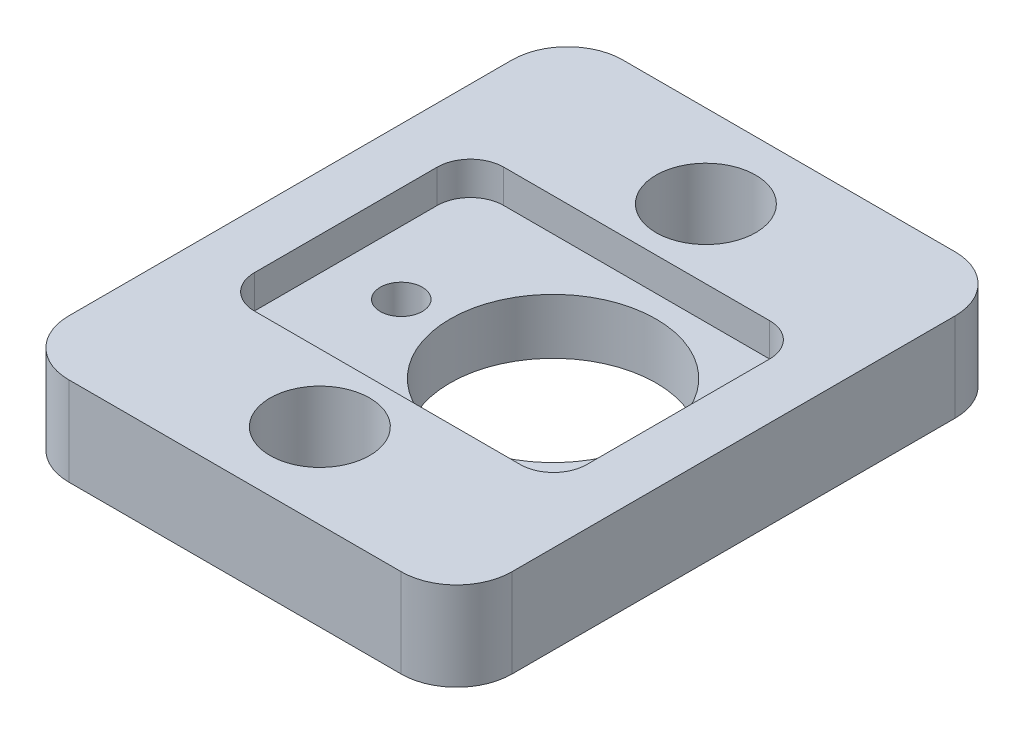
ISO-10303-21;
HEADER;
FILE_DESCRIPTION(('STEP AP214'),'2;1');
FILE_NAME('part.step','',(''),(''),'','','');
FILE_SCHEMA(('AUTOMOTIVE_DESIGN { 1 0 10303 214 1 1 1 1 }'));
ENDSEC;
DATA;
#1=APPLICATION_CONTEXT('core data for automotive mechanical design processes');
#2=APPLICATION_PROTOCOL_DEFINITION('international standard','automotive_design',2000,#1);
#3=PRODUCT_CONTEXT('',#1,'mechanical');
#4=PRODUCT('Part','Part','',(#3));
#5=PRODUCT_RELATED_PRODUCT_CATEGORY('part','',(#4));
#6=PRODUCT_DEFINITION_FORMATION('','',#4);
#7=PRODUCT_DEFINITION_CONTEXT('part definition',#1,'design');
#8=PRODUCT_DEFINITION('design','',#6,#7);
#9=PRODUCT_DEFINITION_SHAPE('','',#8);
#10=(LENGTH_UNIT() NAMED_UNIT(*) SI_UNIT(.MILLI.,.METRE.));
#11=(NAMED_UNIT(*) PLANE_ANGLE_UNIT() SI_UNIT($,.RADIAN.));
#12=(NAMED_UNIT(*) SI_UNIT($,.STERADIAN.) SOLID_ANGLE_UNIT());
#13=UNCERTAINTY_MEASURE_WITH_UNIT(LENGTH_MEASURE(1.E-05),#10,'distance_accuracy_value','');
#14=(GEOMETRIC_REPRESENTATION_CONTEXT(3) GLOBAL_UNCERTAINTY_ASSIGNED_CONTEXT((#13)) GLOBAL_UNIT_ASSIGNED_CONTEXT((#10,
#11,#12)) REPRESENTATION_CONTEXT('',''));
#15=CARTESIAN_POINT('',(0.,0.,0.));
#16=DIRECTION('',(0.,0.,1.));
#17=DIRECTION('',(1.,0.,0.));
#18=AXIS2_PLACEMENT_3D('',#15,#16,#17);
#19=CARTESIAN_POINT('',(2.,3.2,18.));
#20=DIRECTION('',(0.,-1.,0.));
#21=DIRECTION('',(0.,0.,-1.));
#22=AXIS2_PLACEMENT_3D('',#19,#20,#21);
#23=CYLINDRICAL_SURFACE('',#22,2.);
#24=CARTESIAN_POINT('',(2.,0.,18.));
#25=DIRECTION('',(0.,1.,0.));
#26=DIRECTION('',(0.,0.,1.));
#27=AXIS2_PLACEMENT_3D('',#24,#25,#26);
#28=CIRCLE('',#27,2.);
#29=CARTESIAN_POINT('',(0.,0.,18.));
#30=VERTEX_POINT('',#29);
#31=CARTESIAN_POINT('',(2.,0.,20.));
#32=VERTEX_POINT('',#31);
#33=EDGE_CURVE('E141',#30,#32,#28,.T.);
#34=ORIENTED_EDGE('',*,*,#33,.T.);
#35=DIRECTION('',(0.,-1.,0.));
#36=VECTOR('',#35,1.);
#37=CARTESIAN_POINT('',(2.,3.2,20.));
#38=LINE('',#37,#36);
#39=CARTESIAN_POINT('',(2.,3.2,20.));
#40=VERTEX_POINT('',#39);
#41=EDGE_CURVE('E11',#40,#32,#38,.T.);
#42=ORIENTED_EDGE('',*,*,#41,.F.);
#43=CARTESIAN_POINT('',(2.,3.2,18.));
#44=DIRECTION('',(0.,1.,0.));
#45=DIRECTION('',(0.,0.,1.));
#46=AXIS2_PLACEMENT_3D('',#43,#44,#45);
#47=CIRCLE('',#46,2.);
#48=CARTESIAN_POINT('',(0.,3.2,18.));
#49=VERTEX_POINT('',#48);
#50=EDGE_CURVE('E157',#49,#40,#47,.T.);
#51=ORIENTED_EDGE('',*,*,#50,.F.);
#52=DIRECTION('',(0.,-1.,0.));
#53=VECTOR('',#52,1.);
#54=CARTESIAN_POINT('',(0.,3.2,18.));
#55=LINE('',#54,#53);
#56=EDGE_CURVE('E137',#49,#30,#55,.T.);
#57=ORIENTED_EDGE('',*,*,#56,.T.);
#58=EDGE_LOOP('',(#34,#42,#51,#57));
#59=FACE_BOUND('',#58,.T.);
#60=ADVANCED_FACE('F33',(#59),#23,.T.);
#61=CARTESIAN_POINT('',(2.,3.2,20.));
#62=DIRECTION('',(0.,0.,-1.));
#63=DIRECTION('',(-1.,0.,0.));
#64=AXIS2_PLACEMENT_3D('',#61,#62,#63);
#65=PLANE('',#64);
#66=DIRECTION('',(1.,0.,0.));
#67=VECTOR('',#66,1.);
#68=CARTESIAN_POINT('',(2.,0.,20.));
#69=LINE('',#68,#67);
#70=CARTESIAN_POINT('',(14.,0.,20.));
#71=VERTEX_POINT('',#70);
#72=EDGE_CURVE('E144',#32,#71,#69,.T.);
#73=ORIENTED_EDGE('',*,*,#72,.T.);
#74=DIRECTION('',(0.,-1.,0.));
#75=VECTOR('',#74,1.);
#76=CARTESIAN_POINT('',(14.,3.2,20.));
#77=LINE('',#76,#75);
#78=CARTESIAN_POINT('',(14.,3.2,20.));
#79=VERTEX_POINT('',#78);
#80=EDGE_CURVE('E40',#79,#71,#77,.T.);
#81=ORIENTED_EDGE('',*,*,#80,.F.);
#82=DIRECTION('',(1.,0.,0.));
#83=VECTOR('',#82,1.);
#84=CARTESIAN_POINT('',(2.,3.2,20.));
#85=LINE('',#84,#83);
#86=EDGE_CURVE('E97',#40,#79,#85,.T.);
#87=ORIENTED_EDGE('',*,*,#86,.F.);
#88=ORIENTED_EDGE('',*,*,#41,.T.);
#89=EDGE_LOOP('',(#73,#81,#87,#88));
#90=FACE_BOUND('',#89,.T.);
#91=ADVANCED_FACE('F365',(#90),#65,.F.);
#92=CARTESIAN_POINT('',(14.,3.2,18.));
#93=DIRECTION('',(0.,-1.,0.));
#94=DIRECTION('',(0.,0.,-1.));
#95=AXIS2_PLACEMENT_3D('',#92,#93,#94);
#96=CYLINDRICAL_SURFACE('',#95,2.);
#97=CARTESIAN_POINT('',(14.,0.,18.));
#98=DIRECTION('',(0.,1.,0.));
#99=DIRECTION('',(0.,0.,1.));
#100=AXIS2_PLACEMENT_3D('',#97,#98,#99);
#101=CIRCLE('',#100,2.);
#102=CARTESIAN_POINT('',(16.,0.,18.));
#103=VERTEX_POINT('',#102);
#104=EDGE_CURVE('E147',#71,#103,#101,.T.);
#105=ORIENTED_EDGE('',*,*,#104,.T.);
#106=DIRECTION('',(0.,-1.,0.));
#107=VECTOR('',#106,1.);
#108=CARTESIAN_POINT('',(16.,3.2,18.));
#109=LINE('',#108,#107);
#110=CARTESIAN_POINT('',(16.,3.2,18.));
#111=VERTEX_POINT('',#110);
#112=EDGE_CURVE('E164',#111,#103,#109,.T.);
#113=ORIENTED_EDGE('',*,*,#112,.F.);
#114=CARTESIAN_POINT('',(14.,3.2,18.));
#115=DIRECTION('',(0.,1.,0.));
#116=DIRECTION('',(0.,0.,1.));
#117=AXIS2_PLACEMENT_3D('',#114,#115,#116);
#118=CIRCLE('',#117,2.);
#119=EDGE_CURVE('E172',#79,#111,#118,.T.);
#120=ORIENTED_EDGE('',*,*,#119,.F.);
#121=ORIENTED_EDGE('',*,*,#80,.T.);
#122=EDGE_LOOP('',(#105,#113,#120,#121));
#123=FACE_BOUND('',#122,.T.);
#124=ADVANCED_FACE('F170',(#123),#96,.T.);
#125=CARTESIAN_POINT('',(16.,3.2,2.));
#126=DIRECTION('',(-1.,0.,0.));
#127=DIRECTION('',(0.,0.,1.));
#128=AXIS2_PLACEMENT_3D('',#125,#126,#127);
#129=PLANE('',#128);
#130=DIRECTION('',(0.,0.,-1.));
#131=VECTOR('',#130,1.);
#132=CARTESIAN_POINT('',(16.,0.,2.));
#133=LINE('',#132,#131);
#134=CARTESIAN_POINT('',(16.,0.,2.));
#135=VERTEX_POINT('',#134);
#136=EDGE_CURVE('E149',#103,#135,#133,.T.);
#137=ORIENTED_EDGE('',*,*,#136,.T.);
#138=DIRECTION('',(0.,-1.,0.));
#139=VECTOR('',#138,1.);
#140=CARTESIAN_POINT('',(16.,3.2,2.));
#141=LINE('',#140,#139);
#142=CARTESIAN_POINT('',(16.,3.2,2.));
#143=VERTEX_POINT('',#142);
#144=EDGE_CURVE('E161',#143,#135,#141,.T.);
#145=ORIENTED_EDGE('',*,*,#144,.F.);
#146=DIRECTION('',(0.,0.,-1.));
#147=VECTOR('',#146,1.);
#148=CARTESIAN_POINT('',(16.,3.2,2.));
#149=LINE('',#148,#147);
#150=EDGE_CURVE('E184',#111,#143,#149,.T.);
#151=ORIENTED_EDGE('',*,*,#150,.F.);
#152=ORIENTED_EDGE('',*,*,#112,.T.);
#153=EDGE_LOOP('',(#137,#145,#151,#152));
#154=FACE_BOUND('',#153,.T.);
#155=ADVANCED_FACE('F180',(#154),#129,.F.);
#156=CARTESIAN_POINT('',(14.,3.2,2.));
#157=DIRECTION('',(0.,-1.,0.));
#158=DIRECTION('',(0.,0.,-1.));
#159=AXIS2_PLACEMENT_3D('',#156,#157,#158);
#160=CYLINDRICAL_SURFACE('',#159,2.);
#161=CARTESIAN_POINT('',(14.,0.,2.));
#162=DIRECTION('',(0.,1.,0.));
#163=DIRECTION('',(0.,0.,-1.));
#164=AXIS2_PLACEMENT_3D('',#161,#162,#163);
#165=CIRCLE('',#164,2.);
#166=CARTESIAN_POINT('',(14.,0.,0.));
#167=VERTEX_POINT('',#166);
#168=EDGE_CURVE('E151',#135,#167,#165,.T.);
#169=ORIENTED_EDGE('',*,*,#168,.T.);
#170=DIRECTION('',(0.,-1.,0.));
#171=VECTOR('',#170,1.);
#172=CARTESIAN_POINT('',(14.,3.2,0.));
#173=LINE('',#172,#171);
#174=CARTESIAN_POINT('',(14.,3.2,0.));
#175=VERTEX_POINT('',#174);
#176=EDGE_CURVE('E132',#175,#167,#173,.T.);
#177=ORIENTED_EDGE('',*,*,#176,.F.);
#178=CARTESIAN_POINT('',(14.,3.2,2.));
#179=DIRECTION('',(0.,1.,0.));
#180=DIRECTION('',(0.,0.,-1.));
#181=AXIS2_PLACEMENT_3D('',#178,#179,#180);
#182=CIRCLE('',#181,2.);
#183=EDGE_CURVE('E120',#143,#175,#182,.T.);
#184=ORIENTED_EDGE('',*,*,#183,.F.);
#185=ORIENTED_EDGE('',*,*,#144,.T.);
#186=EDGE_LOOP('',(#169,#177,#184,#185));
#187=FACE_BOUND('',#186,.T.);
#188=ADVANCED_FACE('F183',(#187),#160,.T.);
#189=CARTESIAN_POINT('',(2.00000000000001,3.2,0.));
#190=DIRECTION('',(0.,0.,1.));
#191=DIRECTION('',(1.,0.,0.));
#192=AXIS2_PLACEMENT_3D('',#189,#190,#191);
#193=PLANE('',#192);
#194=DIRECTION('',(-1.,0.,0.));
#195=VECTOR('',#194,1.);
#196=CARTESIAN_POINT('',(2.00000000000001,0.,0.));
#197=LINE('',#196,#195);
#198=CARTESIAN_POINT('',(2.00000000000001,0.,0.));
#199=VERTEX_POINT('',#198);
#200=EDGE_CURVE('E129',#167,#199,#197,.T.);
#201=ORIENTED_EDGE('',*,*,#200,.T.);
#202=DIRECTION('',(0.,-1.,0.));
#203=VECTOR('',#202,1.);
#204=CARTESIAN_POINT('',(2.00000000000001,3.2,0.));
#205=LINE('',#204,#203);
#206=CARTESIAN_POINT('',(2.00000000000001,3.2,0.));
#207=VERTEX_POINT('',#206);
#208=EDGE_CURVE('E126',#207,#199,#205,.T.);
#209=ORIENTED_EDGE('',*,*,#208,.F.);
#210=DIRECTION('',(-1.,0.,0.));
#211=VECTOR('',#210,1.);
#212=CARTESIAN_POINT('',(2.00000000000001,3.2,0.));
#213=LINE('',#212,#211);
#214=EDGE_CURVE('E113',#175,#207,#213,.T.);
#215=ORIENTED_EDGE('',*,*,#214,.F.);
#216=ORIENTED_EDGE('',*,*,#176,.T.);
#217=EDGE_LOOP('',(#201,#209,#215,#216));
#218=FACE_BOUND('',#217,.T.);
#219=ADVANCED_FACE('F127',(#218),#193,.F.);
#220=CARTESIAN_POINT('',(2.,3.2,2.));
#221=DIRECTION('',(0.,-1.,0.));
#222=DIRECTION('',(0.,0.,-1.));
#223=AXIS2_PLACEMENT_3D('',#220,#221,#222);
#224=CYLINDRICAL_SURFACE('',#223,2.);
#225=CARTESIAN_POINT('',(2.,0.,2.));
#226=DIRECTION('',(0.,1.,0.));
#227=DIRECTION('',(0.,0.,1.));
#228=AXIS2_PLACEMENT_3D('',#225,#226,#227);
#229=CIRCLE('',#228,2.);
#230=CARTESIAN_POINT('',(0.,0.,2.00000000000001));
#231=VERTEX_POINT('',#230);
#232=EDGE_CURVE('E154',#199,#231,#229,.T.);
#233=ORIENTED_EDGE('',*,*,#232,.T.);
#234=DIRECTION('',(0.,-1.,0.));
#235=VECTOR('',#234,1.);
#236=CARTESIAN_POINT('',(0.,3.2,2.00000000000001));
#237=LINE('',#236,#235);
#238=CARTESIAN_POINT('',(0.,3.2,2.00000000000001));
#239=VERTEX_POINT('',#238);
#240=EDGE_CURVE('E133',#239,#231,#237,.T.);
#241=ORIENTED_EDGE('',*,*,#240,.F.);
#242=CARTESIAN_POINT('',(2.,3.2,2.));
#243=DIRECTION('',(0.,1.,0.));
#244=DIRECTION('',(0.,0.,1.));
#245=AXIS2_PLACEMENT_3D('',#242,#243,#244);
#246=CIRCLE('',#245,2.);
#247=EDGE_CURVE('E117',#207,#239,#246,.T.);
#248=ORIENTED_EDGE('',*,*,#247,.F.);
#249=ORIENTED_EDGE('',*,*,#208,.T.);
#250=EDGE_LOOP('',(#233,#241,#248,#249));
#251=FACE_BOUND('',#250,.T.);
#252=ADVANCED_FACE('F135',(#251),#224,.T.);
#253=CARTESIAN_POINT('',(0.,3.2,2.00000000000001));
#254=DIRECTION('',(1.,0.,0.));
#255=DIRECTION('',(0.,0.,-1.));
#256=AXIS2_PLACEMENT_3D('',#253,#254,#255);
#257=PLANE('',#256);
#258=DIRECTION('',(0.,0.,1.));
#259=VECTOR('',#258,1.);
#260=CARTESIAN_POINT('',(0.,0.,2.00000000000001));
#261=LINE('',#260,#259);
#262=EDGE_CURVE('E89',#231,#30,#261,.T.);
#263=ORIENTED_EDGE('',*,*,#262,.T.);
#264=ORIENTED_EDGE('',*,*,#56,.F.);
#265=DIRECTION('',(0.,0.,1.));
#266=VECTOR('',#265,1.);
#267=CARTESIAN_POINT('',(0.,3.2,2.00000000000001));
#268=LINE('',#267,#266);
#269=EDGE_CURVE('E56',#239,#49,#268,.T.);
#270=ORIENTED_EDGE('',*,*,#269,.F.);
#271=ORIENTED_EDGE('',*,*,#240,.T.);
#272=EDGE_LOOP('',(#263,#264,#270,#271));
#273=FACE_BOUND('',#272,.T.);
#274=ADVANCED_FACE('F372',(#273),#257,.F.);
#275=CARTESIAN_POINT('',(2.,3.2,18.));
#276=DIRECTION('',(0.,1.,0.));
#277=DIRECTION('',(0.,0.,1.));
#278=AXIS2_PLACEMENT_3D('',#275,#276,#277);
#279=PLANE('',#278);
#280=CARTESIAN_POINT('',(8.,3.2,3.));
#281=DIRECTION('',(0.,1.,0.));
#282=DIRECTION('',(0.,0.,1.));
#283=AXIS2_PLACEMENT_3D('',#280,#281,#282);
#284=CIRCLE('',#283,1.8);
#285=CARTESIAN_POINT('',(8.,3.2,4.8));
#286=VERTEX_POINT('',#285);
#287=EDGE_CURVE('E271',#286,#286,#284,.T.);
#288=ORIENTED_EDGE('',*,*,#287,.F.);
#289=EDGE_LOOP('',(#288));
#290=FACE_BOUND('',#289,.T.);
#291=CARTESIAN_POINT('',(8.,3.2,16.9365669232849));
#292=DIRECTION('',(0.,1.,0.));
#293=DIRECTION('',(0.,0.,-1.));
#294=AXIS2_PLACEMENT_3D('',#291,#292,#293);
#295=CIRCLE('',#294,1.8);
#296=CARTESIAN_POINT('',(8.,3.2,15.1365669232849));
#297=VERTEX_POINT('',#296);
#298=EDGE_CURVE('E264',#297,#297,#295,.T.);
#299=ORIENTED_EDGE('',*,*,#298,.F.);
#300=EDGE_LOOP('',(#299));
#301=FACE_BOUND('',#300,.T.);
#302=CARTESIAN_POINT('',(3.2,3.2,13.3));
#303=DIRECTION('',(0.,1.,0.));
#304=DIRECTION('',(0.,0.,1.));
#305=AXIS2_PLACEMENT_3D('',#302,#303,#304);
#306=CIRCLE('',#305,1.2);
#307=CARTESIAN_POINT('',(2.,3.2,13.3));
#308=VERTEX_POINT('',#307);
#309=CARTESIAN_POINT('',(3.2,3.2,14.5));
#310=VERTEX_POINT('',#309);
#311=EDGE_CURVE('E47',#308,#310,#306,.T.);
#312=ORIENTED_EDGE('',*,*,#311,.F.);
#313=DIRECTION('',(0.,0.,1.));
#314=VECTOR('',#313,1.);
#315=CARTESIAN_POINT('',(2.,3.2,6.7));
#316=LINE('',#315,#314);
#317=CARTESIAN_POINT('',(2.,3.2,6.7));
#318=VERTEX_POINT('',#317);
#319=EDGE_CURVE('E212',#318,#308,#316,.T.);
#320=ORIENTED_EDGE('',*,*,#319,.F.);
#321=CARTESIAN_POINT('',(3.2,3.2,6.7));
#322=DIRECTION('',(0.,1.,0.));
#323=DIRECTION('',(0.,0.,1.));
#324=AXIS2_PLACEMENT_3D('',#321,#322,#323);
#325=CIRCLE('',#324,1.2);
#326=CARTESIAN_POINT('',(3.2,3.2,5.5));
#327=VERTEX_POINT('',#326);
#328=EDGE_CURVE('E216',#327,#318,#325,.T.);
#329=ORIENTED_EDGE('',*,*,#328,.F.);
#330=DIRECTION('',(-1.,0.,0.));
#331=VECTOR('',#330,1.);
#332=CARTESIAN_POINT('',(3.2,3.2,5.5));
#333=LINE('',#332,#331);
#334=CARTESIAN_POINT('',(12.8,3.2,5.5));
#335=VERTEX_POINT('',#334);
#336=EDGE_CURVE('E219',#335,#327,#333,.T.);
#337=ORIENTED_EDGE('',*,*,#336,.F.);
#338=CARTESIAN_POINT('',(12.8,3.2,6.7));
#339=DIRECTION('',(0.,1.,0.));
#340=DIRECTION('',(0.,0.,-1.));
#341=AXIS2_PLACEMENT_3D('',#338,#339,#340);
#342=CIRCLE('',#341,1.2);
#343=CARTESIAN_POINT('',(14.,3.2,6.7));
#344=VERTEX_POINT('',#343);
#345=EDGE_CURVE('E222',#344,#335,#342,.T.);
#346=ORIENTED_EDGE('',*,*,#345,.F.);
#347=DIRECTION('',(0.,0.,-1.));
#348=VECTOR('',#347,1.);
#349=CARTESIAN_POINT('',(14.,3.2,6.7));
#350=LINE('',#349,#348);
#351=CARTESIAN_POINT('',(14.,3.2,13.3));
#352=VERTEX_POINT('',#351);
#353=EDGE_CURVE('E225',#352,#344,#350,.T.);
#354=ORIENTED_EDGE('',*,*,#353,.F.);
#355=CARTESIAN_POINT('',(12.8,3.2,13.3));
#356=DIRECTION('',(0.,1.,0.));
#357=DIRECTION('',(0.,0.,1.));
#358=AXIS2_PLACEMENT_3D('',#355,#356,#357);
#359=CIRCLE('',#358,1.2);
#360=CARTESIAN_POINT('',(12.8,3.2,14.5));
#361=VERTEX_POINT('',#360);
#362=EDGE_CURVE('E228',#361,#352,#359,.T.);
#363=ORIENTED_EDGE('',*,*,#362,.F.);
#364=DIRECTION('',(1.,0.,0.));
#365=VECTOR('',#364,1.);
#366=CARTESIAN_POINT('',(3.2,3.2,14.5));
#367=LINE('',#366,#365);
#368=EDGE_CURVE('E231',#310,#361,#367,.T.);
#369=ORIENTED_EDGE('',*,*,#368,.F.);
#370=EDGE_LOOP('',(#312,#320,#329,#337,#346,#354,#363,#369));
#371=FACE_BOUND('',#370,.T.);
#372=ORIENTED_EDGE('',*,*,#50,.T.);
#373=ORIENTED_EDGE('',*,*,#86,.T.);
#374=ORIENTED_EDGE('',*,*,#119,.T.);
#375=ORIENTED_EDGE('',*,*,#150,.T.);
#376=ORIENTED_EDGE('',*,*,#183,.T.);
#377=ORIENTED_EDGE('',*,*,#214,.T.);
#378=ORIENTED_EDGE('',*,*,#247,.T.);
#379=ORIENTED_EDGE('',*,*,#269,.T.);
#380=EDGE_LOOP('',(#372,#373,#374,#375,#376,#377,#378,#379));
#381=FACE_BOUND('',#380,.T.);
#382=ADVANCED_FACE('F115',(#290,#301,#371,#381),#279,.T.);
#383=CARTESIAN_POINT('',(2.,0.,18.));
#384=DIRECTION('',(0.,1.,0.));
#385=DIRECTION('',(0.,0.,1.));
#386=AXIS2_PLACEMENT_3D('',#383,#384,#385);
#387=PLANE('',#386);
#388=CARTESIAN_POINT('',(4.28680880793267,0.,10.2838832878654));
#389=DIRECTION('',(0.,1.,0.));
#390=DIRECTION('',(0.,0.,1.));
#391=AXIS2_PLACEMENT_3D('',#388,#389,#390);
#392=CIRCLE('',#391,0.76);
#393=CARTESIAN_POINT('',(4.28680880793267,0.,11.0438832878654));
#394=VERTEX_POINT('',#393);
#395=EDGE_CURVE('E268',#394,#394,#392,.T.);
#396=ORIENTED_EDGE('',*,*,#395,.T.);
#397=EDGE_LOOP('',(#396));
#398=FACE_BOUND('',#397,.T.);
#399=CARTESIAN_POINT('',(8.,0.,3.));
#400=DIRECTION('',(0.,1.,0.));
#401=DIRECTION('',(0.,0.,1.));
#402=AXIS2_PLACEMENT_3D('',#399,#400,#401);
#403=CIRCLE('',#402,1.8);
#404=CARTESIAN_POINT('',(8.,0.,4.8));
#405=VERTEX_POINT('',#404);
#406=EDGE_CURVE('E261',#405,#405,#403,.T.);
#407=ORIENTED_EDGE('',*,*,#406,.T.);
#408=EDGE_LOOP('',(#407));
#409=FACE_BOUND('',#408,.T.);
#410=CARTESIAN_POINT('',(8.,0.,16.9365669232849));
#411=DIRECTION('',(0.,1.,0.));
#412=DIRECTION('',(0.,0.,-1.));
#413=AXIS2_PLACEMENT_3D('',#410,#411,#412);
#414=CIRCLE('',#413,1.8);
#415=CARTESIAN_POINT('',(8.,0.,15.1365669232849));
#416=VERTEX_POINT('',#415);
#417=EDGE_CURVE('E267',#416,#416,#414,.T.);
#418=ORIENTED_EDGE('',*,*,#417,.T.);
#419=EDGE_LOOP('',(#418));
#420=FACE_BOUND('',#419,.T.);
#421=CARTESIAN_POINT('',(9.5,0.,10.0173544996425));
#422=DIRECTION('',(0.,1.,0.));
#423=DIRECTION('',(0.,0.,1.));
#424=AXIS2_PLACEMENT_3D('',#421,#422,#423);
#425=CIRCLE('',#424,3.72);
#426=CARTESIAN_POINT('',(9.5,0.,13.7373544996425));
#427=VERTEX_POINT('',#426);
#428=EDGE_CURVE('E235',#427,#427,#425,.T.);
#429=ORIENTED_EDGE('',*,*,#428,.T.);
#430=EDGE_LOOP('',(#429));
#431=FACE_BOUND('',#430,.T.);
#432=ORIENTED_EDGE('',*,*,#33,.F.);
#433=ORIENTED_EDGE('',*,*,#262,.F.);
#434=ORIENTED_EDGE('',*,*,#232,.F.);
#435=ORIENTED_EDGE('',*,*,#200,.F.);
#436=ORIENTED_EDGE('',*,*,#168,.F.);
#437=ORIENTED_EDGE('',*,*,#136,.F.);
#438=ORIENTED_EDGE('',*,*,#104,.F.);
#439=ORIENTED_EDGE('',*,*,#72,.F.);
#440=EDGE_LOOP('',(#432,#433,#434,#435,#436,#437,#438,#439));
#441=FACE_BOUND('',#440,.T.);
#442=ADVANCED_FACE('F176',(#398,#409,#420,#431,#441),#387,.F.);
#443=CARTESIAN_POINT('',(3.2,2.,13.3));
#444=DIRECTION('',(0.,1.,0.));
#445=DIRECTION('',(0.,0.,1.));
#446=AXIS2_PLACEMENT_3D('',#443,#444,#445);
#447=CYLINDRICAL_SURFACE('',#446,1.2);
#448=ORIENTED_EDGE('',*,*,#311,.T.);
#449=DIRECTION('',(0.,1.,0.));
#450=VECTOR('',#449,1.);
#451=CARTESIAN_POINT('',(3.2,2.,14.5));
#452=LINE('',#451,#450);
#453=CARTESIAN_POINT('',(3.2,2.,14.5));
#454=VERTEX_POINT('',#453);
#455=EDGE_CURVE('E190',#454,#310,#452,.T.);
#456=ORIENTED_EDGE('',*,*,#455,.F.);
#457=CARTESIAN_POINT('',(3.2,2.,13.3));
#458=DIRECTION('',(0.,1.,0.));
#459=DIRECTION('',(0.,0.,1.));
#460=AXIS2_PLACEMENT_3D('',#457,#458,#459);
#461=CIRCLE('',#460,1.2);
#462=CARTESIAN_POINT('',(2.,2.,13.3));
#463=VERTEX_POINT('',#462);
#464=EDGE_CURVE('E215',#463,#454,#461,.T.);
#465=ORIENTED_EDGE('',*,*,#464,.F.);
#466=DIRECTION('',(0.,1.,0.));
#467=VECTOR('',#466,1.);
#468=CARTESIAN_POINT('',(2.,2.,13.3));
#469=LINE('',#468,#467);
#470=EDGE_CURVE('E145',#463,#308,#469,.T.);
#471=ORIENTED_EDGE('',*,*,#470,.T.);
#472=EDGE_LOOP('',(#448,#456,#465,#471));
#473=FACE_BOUND('',#472,.T.);
#474=ADVANCED_FACE('F299',(#473),#447,.F.);
#475=CARTESIAN_POINT('',(2.,2.,6.7));
#476=DIRECTION('',(-1.,0.,0.));
#477=DIRECTION('',(0.,0.,1.));
#478=AXIS2_PLACEMENT_3D('',#475,#476,#477);
#479=PLANE('',#478);
#480=ORIENTED_EDGE('',*,*,#319,.T.);
#481=ORIENTED_EDGE('',*,*,#470,.F.);
#482=DIRECTION('',(0.,0.,1.));
#483=VECTOR('',#482,1.);
#484=CARTESIAN_POINT('',(2.,2.,6.7));
#485=LINE('',#484,#483);
#486=CARTESIAN_POINT('',(2.,2.,6.7));
#487=VERTEX_POINT('',#486);
#488=EDGE_CURVE('E193',#487,#463,#485,.T.);
#489=ORIENTED_EDGE('',*,*,#488,.F.);
#490=DIRECTION('',(0.,1.,0.));
#491=VECTOR('',#490,1.);
#492=CARTESIAN_POINT('',(2.,2.,6.7));
#493=LINE('',#492,#491);
#494=EDGE_CURVE('E208',#487,#318,#493,.T.);
#495=ORIENTED_EDGE('',*,*,#494,.T.);
#496=EDGE_LOOP('',(#480,#481,#489,#495));
#497=FACE_BOUND('',#496,.T.);
#498=ADVANCED_FACE('F319',(#497),#479,.F.);
#499=CARTESIAN_POINT('',(3.2,2.,6.7));
#500=DIRECTION('',(0.,1.,0.));
#501=DIRECTION('',(0.,0.,1.));
#502=AXIS2_PLACEMENT_3D('',#499,#500,#501);
#503=CYLINDRICAL_SURFACE('',#502,1.2);
#504=ORIENTED_EDGE('',*,*,#328,.T.);
#505=ORIENTED_EDGE('',*,*,#494,.F.);
#506=CARTESIAN_POINT('',(3.2,2.,6.7));
#507=DIRECTION('',(0.,1.,0.));
#508=DIRECTION('',(0.,0.,1.));
#509=AXIS2_PLACEMENT_3D('',#506,#507,#508);
#510=CIRCLE('',#509,1.2);
#511=CARTESIAN_POINT('',(3.2,2.,5.5));
#512=VERTEX_POINT('',#511);
#513=EDGE_CURVE('E238',#512,#487,#510,.T.);
#514=ORIENTED_EDGE('',*,*,#513,.F.);
#515=DIRECTION('',(0.,1.,0.));
#516=VECTOR('',#515,1.);
#517=CARTESIAN_POINT('',(3.2,2.,5.5));
#518=LINE('',#517,#516);
#519=EDGE_CURVE('E205',#512,#327,#518,.T.);
#520=ORIENTED_EDGE('',*,*,#519,.T.);
#521=EDGE_LOOP('',(#504,#505,#514,#520));
#522=FACE_BOUND('',#521,.T.);
#523=ADVANCED_FACE('F324',(#522),#503,.F.);
#524=CARTESIAN_POINT('',(3.2,2.,5.5));
#525=DIRECTION('',(0.,0.,-1.));
#526=DIRECTION('',(-1.,0.,0.));
#527=AXIS2_PLACEMENT_3D('',#524,#525,#526);
#528=PLANE('',#527);
#529=ORIENTED_EDGE('',*,*,#336,.T.);
#530=ORIENTED_EDGE('',*,*,#519,.F.);
#531=DIRECTION('',(-1.,0.,0.));
#532=VECTOR('',#531,1.);
#533=CARTESIAN_POINT('',(3.2,2.,5.5));
#534=LINE('',#533,#532);
#535=CARTESIAN_POINT('',(12.8,2.,5.5));
#536=VERTEX_POINT('',#535);
#537=EDGE_CURVE('E241',#536,#512,#534,.T.);
#538=ORIENTED_EDGE('',*,*,#537,.F.);
#539=DIRECTION('',(0.,1.,0.));
#540=VECTOR('',#539,1.);
#541=CARTESIAN_POINT('',(12.8,2.,5.5));
#542=LINE('',#541,#540);
#543=EDGE_CURVE('E202',#536,#335,#542,.T.);
#544=ORIENTED_EDGE('',*,*,#543,.T.);
#545=EDGE_LOOP('',(#529,#530,#538,#544));
#546=FACE_BOUND('',#545,.T.);
#547=ADVANCED_FACE('F349',(#546),#528,.F.);
#548=CARTESIAN_POINT('',(12.8,2.,6.7));
#549=DIRECTION('',(0.,1.,0.));
#550=DIRECTION('',(0.,0.,1.));
#551=AXIS2_PLACEMENT_3D('',#548,#549,#550);
#552=CYLINDRICAL_SURFACE('',#551,1.2);
#553=ORIENTED_EDGE('',*,*,#345,.T.);
#554=ORIENTED_EDGE('',*,*,#543,.F.);
#555=CARTESIAN_POINT('',(12.8,2.,6.7));
#556=DIRECTION('',(0.,1.,0.));
#557=DIRECTION('',(0.,0.,-1.));
#558=AXIS2_PLACEMENT_3D('',#555,#556,#557);
#559=CIRCLE('',#558,1.2);
#560=CARTESIAN_POINT('',(14.,2.,6.7));
#561=VERTEX_POINT('',#560);
#562=EDGE_CURVE('E244',#561,#536,#559,.T.);
#563=ORIENTED_EDGE('',*,*,#562,.F.);
#564=DIRECTION('',(0.,1.,0.));
#565=VECTOR('',#564,1.);
#566=CARTESIAN_POINT('',(14.,2.,6.7));
#567=LINE('',#566,#565);
#568=EDGE_CURVE('E199',#561,#344,#567,.T.);
#569=ORIENTED_EDGE('',*,*,#568,.T.);
#570=EDGE_LOOP('',(#553,#554,#563,#569));
#571=FACE_BOUND('',#570,.T.);
#572=ADVANCED_FACE('F352',(#571),#552,.F.);
#573=CARTESIAN_POINT('',(14.,2.,6.7));
#574=DIRECTION('',(1.,0.,0.));
#575=DIRECTION('',(0.,0.,-1.));
#576=AXIS2_PLACEMENT_3D('',#573,#574,#575);
#577=PLANE('',#576);
#578=ORIENTED_EDGE('',*,*,#353,.T.);
#579=ORIENTED_EDGE('',*,*,#568,.F.);
#580=DIRECTION('',(0.,0.,-1.));
#581=VECTOR('',#580,1.);
#582=CARTESIAN_POINT('',(14.,2.,6.7));
#583=LINE('',#582,#581);
#584=CARTESIAN_POINT('',(14.,2.,13.3));
#585=VERTEX_POINT('',#584);
#586=EDGE_CURVE('E247',#585,#561,#583,.T.);
#587=ORIENTED_EDGE('',*,*,#586,.F.);
#588=DIRECTION('',(0.,1.,0.));
#589=VECTOR('',#588,1.);
#590=CARTESIAN_POINT('',(14.,2.,13.3));
#591=LINE('',#590,#589);
#592=EDGE_CURVE('E196',#585,#352,#591,.T.);
#593=ORIENTED_EDGE('',*,*,#592,.T.);
#594=EDGE_LOOP('',(#578,#579,#587,#593));
#595=FACE_BOUND('',#594,.T.);
#596=ADVANCED_FACE('F355',(#595),#577,.F.);
#597=CARTESIAN_POINT('',(12.8,2.,13.3));
#598=DIRECTION('',(0.,1.,0.));
#599=DIRECTION('',(0.,0.,1.));
#600=AXIS2_PLACEMENT_3D('',#597,#598,#599);
#601=CYLINDRICAL_SURFACE('',#600,1.2);
#602=ORIENTED_EDGE('',*,*,#362,.T.);
#603=ORIENTED_EDGE('',*,*,#592,.F.);
#604=CARTESIAN_POINT('',(12.8,2.,13.3));
#605=DIRECTION('',(0.,1.,0.));
#606=DIRECTION('',(0.,0.,1.));
#607=AXIS2_PLACEMENT_3D('',#604,#605,#606);
#608=CIRCLE('',#607,1.2);
#609=CARTESIAN_POINT('',(12.8,2.,14.5));
#610=VERTEX_POINT('',#609);
#611=EDGE_CURVE('E250',#610,#585,#608,.T.);
#612=ORIENTED_EDGE('',*,*,#611,.F.);
#613=DIRECTION('',(0.,1.,0.));
#614=VECTOR('',#613,1.);
#615=CARTESIAN_POINT('',(12.8,2.,14.5));
#616=LINE('',#615,#614);
#617=EDGE_CURVE('E192',#610,#361,#616,.T.);
#618=ORIENTED_EDGE('',*,*,#617,.T.);
#619=EDGE_LOOP('',(#602,#603,#612,#618));
#620=FACE_BOUND('',#619,.T.);
#621=ADVANCED_FACE('F338',(#620),#601,.F.);
#622=CARTESIAN_POINT('',(3.2,2.,14.5));
#623=DIRECTION('',(0.,0.,1.));
#624=DIRECTION('',(1.,0.,0.));
#625=AXIS2_PLACEMENT_3D('',#622,#623,#624);
#626=PLANE('',#625);
#627=ORIENTED_EDGE('',*,*,#368,.T.);
#628=ORIENTED_EDGE('',*,*,#617,.F.);
#629=DIRECTION('',(1.,0.,0.));
#630=VECTOR('',#629,1.);
#631=CARTESIAN_POINT('',(3.2,2.,14.5));
#632=LINE('',#631,#630);
#633=EDGE_CURVE('E253',#454,#610,#632,.T.);
#634=ORIENTED_EDGE('',*,*,#633,.F.);
#635=ORIENTED_EDGE('',*,*,#455,.T.);
#636=EDGE_LOOP('',(#627,#628,#634,#635));
#637=FACE_BOUND('',#636,.T.);
#638=ADVANCED_FACE('F289',(#637),#626,.F.);
#639=CARTESIAN_POINT('',(3.2,2.,13.3));
#640=DIRECTION('',(0.,1.,0.));
#641=DIRECTION('',(0.,0.,1.));
#642=AXIS2_PLACEMENT_3D('',#639,#640,#641);
#643=PLANE('',#642);
#644=CARTESIAN_POINT('',(4.28680880793267,2.,10.2838832878654));
#645=DIRECTION('',(0.,1.,0.));
#646=DIRECTION('',(0.,0.,1.));
#647=AXIS2_PLACEMENT_3D('',#644,#645,#646);
#648=CIRCLE('',#647,0.76);
#649=CARTESIAN_POINT('',(4.28680880793267,2.,11.0438832878654));
#650=VERTEX_POINT('',#649);
#651=EDGE_CURVE('E278',#650,#650,#648,.T.);
#652=ORIENTED_EDGE('',*,*,#651,.F.);
#653=EDGE_LOOP('',(#652));
#654=FACE_BOUND('',#653,.T.);
#655=CARTESIAN_POINT('',(9.5,2.,10.0173544996425));
#656=DIRECTION('',(0.,1.,0.));
#657=DIRECTION('',(0.,0.,1.));
#658=AXIS2_PLACEMENT_3D('',#655,#656,#657);
#659=CIRCLE('',#658,3.72);
#660=CARTESIAN_POINT('',(9.5,2.,13.7373544996425));
#661=VERTEX_POINT('',#660);
#662=EDGE_CURVE('E258',#661,#661,#659,.T.);
#663=ORIENTED_EDGE('',*,*,#662,.F.);
#664=EDGE_LOOP('',(#663));
#665=FACE_BOUND('',#664,.T.);
#666=ORIENTED_EDGE('',*,*,#464,.T.);
#667=ORIENTED_EDGE('',*,*,#633,.T.);
#668=ORIENTED_EDGE('',*,*,#611,.T.);
#669=ORIENTED_EDGE('',*,*,#586,.T.);
#670=ORIENTED_EDGE('',*,*,#562,.T.);
#671=ORIENTED_EDGE('',*,*,#537,.T.);
#672=ORIENTED_EDGE('',*,*,#513,.T.);
#673=ORIENTED_EDGE('',*,*,#488,.T.);
#674=EDGE_LOOP('',(#666,#667,#668,#669,#670,#671,#672,#673));
#675=FACE_BOUND('',#674,.T.);
#676=ADVANCED_FACE('F285',(#654,#665,#675),#643,.T.);
#677=CARTESIAN_POINT('',(9.5,0.,10.0173544996425));
#678=DIRECTION('',(0.,1.,0.));
#679=DIRECTION('',(0.,0.,1.));
#680=AXIS2_PLACEMENT_3D('',#677,#678,#679);
#681=CYLINDRICAL_SURFACE('',#680,3.72);
#682=ORIENTED_EDGE('',*,*,#428,.F.);
#683=EDGE_LOOP('',(#682));
#684=FACE_BOUND('',#683,.T.);
#685=ORIENTED_EDGE('',*,*,#662,.T.);
#686=EDGE_LOOP('',(#685));
#687=FACE_BOUND('',#686,.T.);
#688=ADVANCED_FACE('F288',(#684,#687),#681,.F.);
#689=CARTESIAN_POINT('',(8.,0.,16.9365669232849));
#690=DIRECTION('',(0.,1.,0.));
#691=DIRECTION('',(0.,0.,1.));
#692=AXIS2_PLACEMENT_3D('',#689,#690,#691);
#693=CYLINDRICAL_SURFACE('',#692,1.8);
#694=ORIENTED_EDGE('',*,*,#417,.F.);
#695=EDGE_LOOP('',(#694));
#696=FACE_BOUND('',#695,.T.);
#697=ORIENTED_EDGE('',*,*,#298,.T.);
#698=EDGE_LOOP('',(#697));
#699=FACE_BOUND('',#698,.T.);
#700=ADVANCED_FACE('F484',(#696,#699),#693,.F.);
#701=CARTESIAN_POINT('',(8.,0.,3.));
#702=DIRECTION('',(0.,1.,0.));
#703=DIRECTION('',(0.,0.,1.));
#704=AXIS2_PLACEMENT_3D('',#701,#702,#703);
#705=CYLINDRICAL_SURFACE('',#704,1.8);
#706=ORIENTED_EDGE('',*,*,#406,.F.);
#707=EDGE_LOOP('',(#706));
#708=FACE_BOUND('',#707,.T.);
#709=ORIENTED_EDGE('',*,*,#287,.T.);
#710=EDGE_LOOP('',(#709));
#711=FACE_BOUND('',#710,.T.);
#712=ADVANCED_FACE('F499',(#708,#711),#705,.F.);
#713=CARTESIAN_POINT('',(4.28680880793267,-8.,10.2838832878654));
#714=DIRECTION('',(0.,1.,0.));
#715=DIRECTION('',(0.,0.,1.));
#716=AXIS2_PLACEMENT_3D('',#713,#714,#715);
#717=CYLINDRICAL_SURFACE('',#716,0.76);
#718=ORIENTED_EDGE('',*,*,#651,.T.);
#719=EDGE_LOOP('',(#718));
#720=FACE_BOUND('',#719,.T.);
#721=ORIENTED_EDGE('',*,*,#395,.F.);
#722=EDGE_LOOP('',(#721));
#723=FACE_BOUND('',#722,.T.);
#724=ADVANCED_FACE('F282',(#720,#723),#717,.F.);
#725=CLOSED_SHELL('',(#60,#91,#124,#155,#188,#219,#252,#274,#382,#442,#474,#498,#523,#547,#572,
#596,#621,#638,#676,#688,#700,#712,#724));
#726=MANIFOLD_SOLID_BREP('B2',#725);
#727=ADVANCED_BREP_SHAPE_REPRESENTATION('',(#18,#726),#14);
#728=SHAPE_DEFINITION_REPRESENTATION(#9,#727);
ENDSEC;
END-ISO-10303-21;
